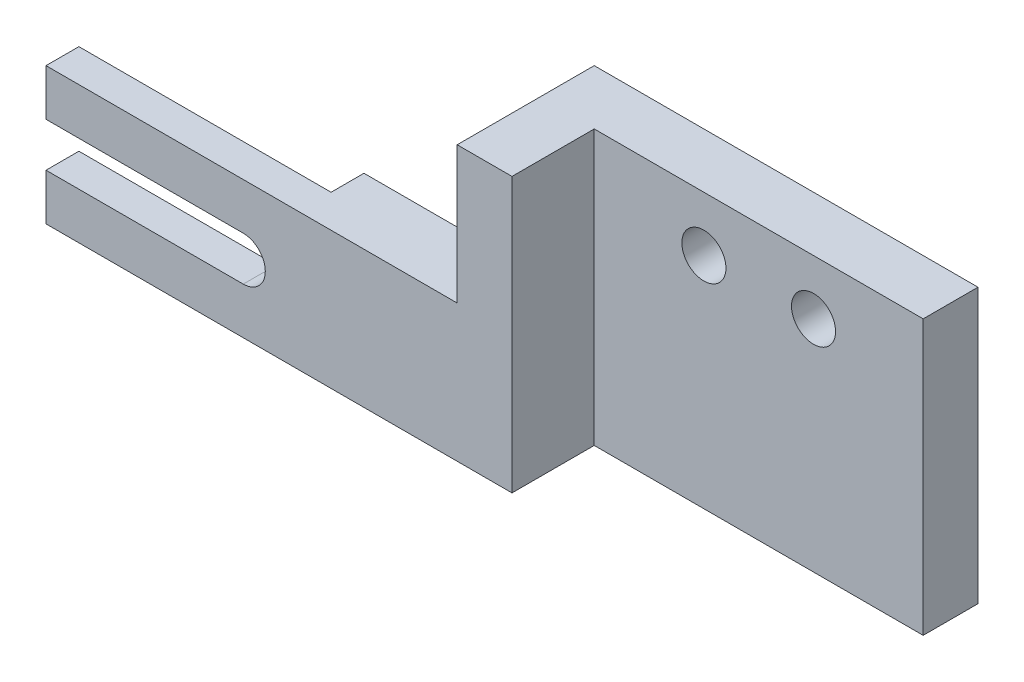
ISO-10303-21;
HEADER;
FILE_DESCRIPTION(('STEP AP214'),'2;1');
FILE_NAME('part.step','',(''),(''),'','','');
FILE_SCHEMA(('AUTOMOTIVE_DESIGN { 1 0 10303 214 1 1 1 1 }'));
ENDSEC;
DATA;
#1=APPLICATION_CONTEXT('core data for automotive mechanical design processes');
#2=APPLICATION_PROTOCOL_DEFINITION('international standard','automotive_design',2000,#1);
#3=PRODUCT_CONTEXT('',#1,'mechanical');
#4=PRODUCT('Part','Part','',(#3));
#5=PRODUCT_RELATED_PRODUCT_CATEGORY('part','',(#4));
#6=PRODUCT_DEFINITION_FORMATION('','',#4);
#7=PRODUCT_DEFINITION_CONTEXT('part definition',#1,'design');
#8=PRODUCT_DEFINITION('design','',#6,#7);
#9=PRODUCT_DEFINITION_SHAPE('','',#8);
#10=(LENGTH_UNIT() NAMED_UNIT(*) SI_UNIT(.MILLI.,.METRE.));
#11=(NAMED_UNIT(*) PLANE_ANGLE_UNIT() SI_UNIT($,.RADIAN.));
#12=(NAMED_UNIT(*) SI_UNIT($,.STERADIAN.) SOLID_ANGLE_UNIT());
#13=UNCERTAINTY_MEASURE_WITH_UNIT(LENGTH_MEASURE(1.E-05),#10,'distance_accuracy_value','');
#14=(GEOMETRIC_REPRESENTATION_CONTEXT(3) GLOBAL_UNCERTAINTY_ASSIGNED_CONTEXT((#13)) GLOBAL_UNIT_ASSIGNED_CONTEXT((#10,
#11,#12)) REPRESENTATION_CONTEXT('',''));
#15=CARTESIAN_POINT('',(0.,0.,0.));
#16=DIRECTION('',(0.,0.,1.));
#17=DIRECTION('',(1.,0.,0.));
#18=AXIS2_PLACEMENT_3D('',#15,#16,#17);
#19=CARTESIAN_POINT('',(1.58750000000002,15.875,-7.9375));
#20=DIRECTION('',(1.,0.,0.));
#21=DIRECTION('',(0.,1.,0.));
#22=AXIS2_PLACEMENT_3D('',#19,#20,#21);
#23=PLANE('',#22);
#24=DIRECTION('',(0.,-1.,0.));
#25=VECTOR('',#24,1.);
#26=CARTESIAN_POINT('',(1.58750000000002,0.,0.3175));
#27=LINE('',#26,#25);
#28=CARTESIAN_POINT('',(1.58750000000002,0.,0.3175));
#29=VERTEX_POINT('',#28);
#30=CARTESIAN_POINT('',(1.58750000000002,-15.875,0.3175));
#31=VERTEX_POINT('',#30);
#32=EDGE_CURVE('E225',#29,#31,#27,.T.);
#33=ORIENTED_EDGE('',*,*,#32,.F.);
#34=DIRECTION('',(0.,0.,1.));
#35=VECTOR('',#34,1.);
#36=CARTESIAN_POINT('',(1.58750000000002,0.,-7.9375));
#37=LINE('',#36,#35);
#38=CARTESIAN_POINT('',(1.58750000000002,0.,7.9375));
#39=VERTEX_POINT('',#38);
#40=EDGE_CURVE('E126',#29,#39,#37,.T.);
#41=ORIENTED_EDGE('',*,*,#40,.T.);
#42=DIRECTION('',(0.,1.,0.));
#43=VECTOR('',#42,1.);
#44=CARTESIAN_POINT('',(1.58750000000002,15.875,7.9375));
#45=LINE('',#44,#43);
#46=CARTESIAN_POINT('',(1.58750000000002,15.875,7.9375));
#47=VERTEX_POINT('',#46);
#48=EDGE_CURVE('E347',#39,#47,#45,.T.);
#49=ORIENTED_EDGE('',*,*,#48,.T.);
#50=DIRECTION('',(0.,0.,1.));
#51=VECTOR('',#50,1.);
#52=CARTESIAN_POINT('',(1.58750000000002,15.875,-7.9375));
#53=LINE('',#52,#51);
#54=CARTESIAN_POINT('',(1.58750000000002,15.875,-7.9375));
#55=VERTEX_POINT('',#54);
#56=EDGE_CURVE('E352',#55,#47,#53,.T.);
#57=ORIENTED_EDGE('',*,*,#56,.F.);
#58=DIRECTION('',(0.,1.,0.));
#59=VECTOR('',#58,1.);
#60=CARTESIAN_POINT('',(1.58750000000002,15.875,-7.9375));
#61=LINE('',#60,#59);
#62=CARTESIAN_POINT('',(1.58750000000002,-15.875,-7.9375));
#63=VERTEX_POINT('',#62);
#64=EDGE_CURVE('E342',#63,#55,#61,.T.);
#65=ORIENTED_EDGE('',*,*,#64,.F.);
#66=DIRECTION('',(0.,0.,-1.));
#67=VECTOR('',#66,1.);
#68=CARTESIAN_POINT('',(1.58750000000002,-15.875,-7.9375));
#69=LINE('',#68,#67);
#70=EDGE_CURVE('E133',#31,#63,#69,.T.);
#71=ORIENTED_EDGE('',*,*,#70,.F.);
#72=EDGE_LOOP('',(#33,#41,#49,#57,#65,#71));
#73=FACE_BOUND('',#72,.T.);
#74=ADVANCED_FACE('F110',(#73),#23,.F.);
#75=CARTESIAN_POINT('',(-46.0375,-15.876,4.1275));
#76=DIRECTION('',(0.,0.,1.));
#77=DIRECTION('',(1.,0.,0.));
#78=AXIS2_PLACEMENT_3D('',#75,#76,#77);
#79=PLANE('',#78);
#80=DIRECTION('',(0.,1.,0.));
#81=VECTOR('',#80,1.);
#82=CARTESIAN_POINT('',(-16.8275,0.,4.1275));
#83=LINE('',#82,#81);
#84=CARTESIAN_POINT('',(-16.8275,-15.875,4.1275));
#85=VERTEX_POINT('',#84);
#86=CARTESIAN_POINT('',(-16.8275,0.,4.1275));
#87=VERTEX_POINT('',#86);
#88=EDGE_CURVE('E251',#85,#87,#83,.T.);
#89=ORIENTED_EDGE('',*,*,#88,.F.);
#90=DIRECTION('',(1.,0.,0.));
#91=VECTOR('',#90,1.);
#92=CARTESIAN_POINT('',(-46.0375,-15.875,4.1275));
#93=LINE('',#92,#91);
#94=CARTESIAN_POINT('',(-46.0375,-15.875,4.1275));
#95=VERTEX_POINT('',#94);
#96=EDGE_CURVE('E234',#95,#85,#93,.T.);
#97=ORIENTED_EDGE('',*,*,#96,.F.);
#98=DIRECTION('',(0.,1.,0.));
#99=VECTOR('',#98,1.);
#100=CARTESIAN_POINT('',(-46.0375,-15.876,4.1275));
#101=LINE('',#100,#99);
#102=CARTESIAN_POINT('',(-46.0375,-10.4902,4.1275));
#103=VERTEX_POINT('',#102);
#104=EDGE_CURVE('E296',#95,#103,#101,.T.);
#105=ORIENTED_EDGE('',*,*,#104,.T.);
#106=DIRECTION('',(1.,0.,0.));
#107=VECTOR('',#106,1.);
#108=CARTESIAN_POINT('',(-46.0375,-10.4902,4.1275));
#109=LINE('',#108,#107);
#110=CARTESIAN_POINT('',(-23.1902,-10.4902,4.1275));
#111=VERTEX_POINT('',#110);
#112=EDGE_CURVE('E300',#103,#111,#109,.T.);
#113=ORIENTED_EDGE('',*,*,#112,.T.);
#114=CARTESIAN_POINT('',(-23.1902,-7.9375,4.1275));
#115=DIRECTION('',(0.,0.,1.));
#116=DIRECTION('',(1.,0.,0.));
#117=AXIS2_PLACEMENT_3D('',#114,#115,#116);
#118=CIRCLE('',#117,2.5527);
#119=CARTESIAN_POINT('',(-23.1902,-5.3848,4.1275));
#120=VERTEX_POINT('',#119);
#121=EDGE_CURVE('E297',#111,#120,#118,.T.);
#122=ORIENTED_EDGE('',*,*,#121,.T.);
#123=DIRECTION('',(-1.,0.,0.));
#124=VECTOR('',#123,1.);
#125=CARTESIAN_POINT('',(-46.0375,-5.3848,4.1275));
#126=LINE('',#125,#124);
#127=CARTESIAN_POINT('',(-46.0375,-5.3848,4.1275));
#128=VERTEX_POINT('',#127);
#129=EDGE_CURVE('E303',#120,#128,#126,.T.);
#130=ORIENTED_EDGE('',*,*,#129,.T.);
#131=CARTESIAN_POINT('',(-46.0375,0.,4.1275));
#132=VERTEX_POINT('',#131);
#133=EDGE_CURVE('E293',#128,#132,#101,.T.);
#134=ORIENTED_EDGE('',*,*,#133,.T.);
#135=DIRECTION('',(1.,0.,0.));
#136=VECTOR('',#135,1.);
#137=CARTESIAN_POINT('',(-46.0375,0.,4.1275));
#138=LINE('',#137,#136);
#139=EDGE_CURVE('E290',#132,#87,#138,.T.);
#140=ORIENTED_EDGE('',*,*,#139,.T.);
#141=EDGE_LOOP('',(#89,#97,#105,#113,#122,#130,#134,#140));
#142=FACE_BOUND('',#141,.T.);
#143=ADVANCED_FACE('F427',(#142),#79,.F.);
#144=CARTESIAN_POINT('',(-46.0375,15.875,7.9375));
#145=DIRECTION('',(1.,0.,0.));
#146=DIRECTION('',(0.,0.,-1.));
#147=AXIS2_PLACEMENT_3D('',#144,#145,#146);
#148=PLANE('',#147);
#149=DIRECTION('',(0.,0.,1.));
#150=VECTOR('',#149,1.);
#151=CARTESIAN_POINT('',(-46.0375,0.,-7.9375));
#152=LINE('',#151,#150);
#153=CARTESIAN_POINT('',(-46.0375,0.,7.9375));
#154=VERTEX_POINT('',#153);
#155=EDGE_CURVE('E346',#132,#154,#152,.T.);
#156=ORIENTED_EDGE('',*,*,#155,.F.);
#157=ORIENTED_EDGE('',*,*,#133,.F.);
#158=DIRECTION('',(0.,0.,1.));
#159=VECTOR('',#158,1.);
#160=CARTESIAN_POINT('',(-46.0375,-5.3848,7.9375));
#161=LINE('',#160,#159);
#162=CARTESIAN_POINT('',(-46.0375,-5.3848,7.9375));
#163=VERTEX_POINT('',#162);
#164=EDGE_CURVE('E330',#128,#163,#161,.T.);
#165=ORIENTED_EDGE('',*,*,#164,.T.);
#166=DIRECTION('',(0.,-1.,0.));
#167=VECTOR('',#166,1.);
#168=CARTESIAN_POINT('',(-46.0375,15.875,7.9375));
#169=LINE('',#168,#167);
#170=EDGE_CURVE('E119',#154,#163,#169,.T.);
#171=ORIENTED_EDGE('',*,*,#170,.F.);
#172=EDGE_LOOP('',(#156,#157,#165,#171));
#173=FACE_BOUND('',#172,.T.);
#174=ADVANCED_FACE('F424',(#173),#148,.F.);
#175=CARTESIAN_POINT('',(-46.0375,15.875,7.9375));
#176=DIRECTION('',(0.,0.,-1.));
#177=DIRECTION('',(-1.,0.,0.));
#178=AXIS2_PLACEMENT_3D('',#175,#176,#177);
#179=PLANE('',#178);
#180=DIRECTION('',(1.,0.,0.));
#181=VECTOR('',#180,1.);
#182=CARTESIAN_POINT('',(-46.0375,-15.875,7.9375));
#183=LINE('',#182,#181);
#184=CARTESIAN_POINT('',(-46.0375,-15.875,7.9375));
#185=VERTEX_POINT('',#184);
#186=CARTESIAN_POINT('',(7.93750000000002,-15.875,7.9375));
#187=VERTEX_POINT('',#186);
#188=EDGE_CURVE('E365',#185,#187,#183,.T.);
#189=ORIENTED_EDGE('',*,*,#188,.T.);
#190=DIRECTION('',(0.,1.,0.));
#191=VECTOR('',#190,1.);
#192=CARTESIAN_POINT('',(7.93750000000002,-15.876,7.9375));
#193=LINE('',#192,#191);
#194=CARTESIAN_POINT('',(7.93750000000002,15.875,7.9375));
#195=VERTEX_POINT('',#194);
#196=EDGE_CURVE('E267',#187,#195,#193,.T.);
#197=ORIENTED_EDGE('',*,*,#196,.T.);
#198=DIRECTION('',(1.,0.,0.));
#199=VECTOR('',#198,1.);
#200=CARTESIAN_POINT('',(-46.0375,15.875,7.9375));
#201=LINE('',#200,#199);
#202=EDGE_CURVE('E368',#47,#195,#201,.T.);
#203=ORIENTED_EDGE('',*,*,#202,.F.);
#204=ORIENTED_EDGE('',*,*,#48,.F.);
#205=DIRECTION('',(1.,0.,0.));
#206=VECTOR('',#205,1.);
#207=CARTESIAN_POINT('',(-46.0375,0.,7.9375));
#208=LINE('',#207,#206);
#209=EDGE_CURVE('E341',#154,#39,#208,.T.);
#210=ORIENTED_EDGE('',*,*,#209,.F.);
#211=ORIENTED_EDGE('',*,*,#170,.T.);
#212=DIRECTION('',(1.,0.,0.));
#213=VECTOR('',#212,1.);
#214=CARTESIAN_POINT('',(-56.1848,-5.3848,7.9375));
#215=LINE('',#214,#213);
#216=CARTESIAN_POINT('',(-23.1902,-5.3848,7.9375));
#217=VERTEX_POINT('',#216);
#218=EDGE_CURVE('E311',#163,#217,#215,.T.);
#219=ORIENTED_EDGE('',*,*,#218,.T.);
#220=CARTESIAN_POINT('',(-23.1902,-7.9375,7.9375));
#221=DIRECTION('',(0.,0.,1.));
#222=DIRECTION('',(1.,0.,0.));
#223=AXIS2_PLACEMENT_3D('',#220,#221,#222);
#224=CIRCLE('',#223,2.5527);
#225=CARTESIAN_POINT('',(-23.1902,-10.4902,7.9375));
#226=VERTEX_POINT('',#225);
#227=EDGE_CURVE('E315',#226,#217,#224,.T.);
#228=ORIENTED_EDGE('',*,*,#227,.F.);
#229=DIRECTION('',(1.,0.,0.));
#230=VECTOR('',#229,1.);
#231=CARTESIAN_POINT('',(-56.1848,-10.4902,7.9375));
#232=LINE('',#231,#230);
#233=CARTESIAN_POINT('',(-46.0375,-10.4902,7.9375));
#234=VERTEX_POINT('',#233);
#235=EDGE_CURVE('E308',#234,#226,#232,.T.);
#236=ORIENTED_EDGE('',*,*,#235,.F.);
#237=EDGE_CURVE('E372',#234,#185,#169,.T.);
#238=ORIENTED_EDGE('',*,*,#237,.T.);
#239=EDGE_LOOP('',(#189,#197,#203,#204,#210,#211,#219,#228,#236,#238));
#240=FACE_BOUND('',#239,.T.);
#241=ADVANCED_FACE('F394',(#240),#179,.F.);
#242=CARTESIAN_POINT('',(46.0375,15.875,7.9375));
#243=DIRECTION('',(-1.,0.,0.));
#244=DIRECTION('',(0.,0.,1.));
#245=AXIS2_PLACEMENT_3D('',#242,#243,#244);
#246=PLANE('',#245);
#247=DIRECTION('',(0.,0.,-1.));
#248=VECTOR('',#247,1.);
#249=CARTESIAN_POINT('',(46.0375,15.875,7.9375));
#250=LINE('',#249,#248);
#251=CARTESIAN_POINT('',(46.0375,15.875,-1.5875));
#252=VERTEX_POINT('',#251);
#253=CARTESIAN_POINT('',(46.0375,15.875,-7.9375));
#254=VERTEX_POINT('',#253);
#255=EDGE_CURVE('E361',#252,#254,#250,.T.);
#256=ORIENTED_EDGE('',*,*,#255,.F.);
#257=DIRECTION('',(0.,1.,0.));
#258=VECTOR('',#257,1.);
#259=CARTESIAN_POINT('',(46.0375,-15.876,-1.5875));
#260=LINE('',#259,#258);
#261=CARTESIAN_POINT('',(46.0375,-15.875,-1.5875));
#262=VERTEX_POINT('',#261);
#263=EDGE_CURVE('E266',#262,#252,#260,.T.);
#264=ORIENTED_EDGE('',*,*,#263,.F.);
#265=DIRECTION('',(0.,0.,-1.));
#266=VECTOR('',#265,1.);
#267=CARTESIAN_POINT('',(46.0375,-15.875,7.9375));
#268=LINE('',#267,#266);
#269=CARTESIAN_POINT('',(46.0375,-15.875,-7.9375));
#270=VERTEX_POINT('',#269);
#271=EDGE_CURVE('E356',#262,#270,#268,.T.);
#272=ORIENTED_EDGE('',*,*,#271,.T.);
#273=DIRECTION('',(0.,-1.,0.));
#274=VECTOR('',#273,1.);
#275=CARTESIAN_POINT('',(46.0375,15.875,-7.9375));
#276=LINE('',#275,#274);
#277=EDGE_CURVE('E13',#254,#270,#276,.T.);
#278=ORIENTED_EDGE('',*,*,#277,.F.);
#279=EDGE_LOOP('',(#256,#264,#272,#278));
#280=FACE_BOUND('',#279,.T.);
#281=ADVANCED_FACE('F112',(#280),#246,.F.);
#282=CARTESIAN_POINT('',(-46.0375,15.875,-7.9375));
#283=DIRECTION('',(0.,0.,1.));
#284=DIRECTION('',(1.,0.,0.));
#285=AXIS2_PLACEMENT_3D('',#282,#283,#284);
#286=PLANE('',#285);
#287=CARTESIAN_POINT('',(33.3375,9.525,-7.9375));
#288=DIRECTION('',(0.,0.,1.));
#289=DIRECTION('',(1.,0.,0.));
#290=AXIS2_PLACEMENT_3D('',#287,#288,#289);
#291=CIRCLE('',#290,2.5527);
#292=CARTESIAN_POINT('',(35.8902,9.525,-7.9375));
#293=VERTEX_POINT('',#292);
#294=EDGE_CURVE('E333',#293,#293,#291,.T.);
#295=ORIENTED_EDGE('',*,*,#294,.T.);
#296=EDGE_LOOP('',(#295));
#297=FACE_BOUND('',#296,.T.);
#298=CARTESIAN_POINT('',(20.6375,9.525,-7.9375));
#299=DIRECTION('',(0.,0.,1.));
#300=DIRECTION('',(1.,0.,0.));
#301=AXIS2_PLACEMENT_3D('',#298,#299,#300);
#302=CIRCLE('',#301,2.5527);
#303=CARTESIAN_POINT('',(23.1902,9.525,-7.9375));
#304=VERTEX_POINT('',#303);
#305=EDGE_CURVE('E337',#304,#304,#302,.T.);
#306=ORIENTED_EDGE('',*,*,#305,.T.);
#307=EDGE_LOOP('',(#306));
#308=FACE_BOUND('',#307,.T.);
#309=DIRECTION('',(-1.,0.,0.));
#310=VECTOR('',#309,1.);
#311=CARTESIAN_POINT('',(-46.0375,-15.875,-7.9375));
#312=LINE('',#311,#310);
#313=EDGE_CURVE('E375',#270,#63,#312,.T.);
#314=ORIENTED_EDGE('',*,*,#313,.T.);
#315=ORIENTED_EDGE('',*,*,#64,.T.);
#316=DIRECTION('',(-1.,0.,0.));
#317=VECTOR('',#316,1.);
#318=CARTESIAN_POINT('',(-46.0375,15.875,-7.9375));
#319=LINE('',#318,#317);
#320=EDGE_CURVE('E364',#254,#55,#319,.T.);
#321=ORIENTED_EDGE('',*,*,#320,.F.);
#322=ORIENTED_EDGE('',*,*,#277,.T.);
#323=EDGE_LOOP('',(#314,#315,#321,#322));
#324=FACE_BOUND('',#323,.T.);
#325=ADVANCED_FACE('F414',(#297,#308,#324),#286,.F.);
#326=DIRECTION('',(0.,0.,-1.));
#327=VECTOR('',#326,1.);
#328=CARTESIAN_POINT('',(-46.0375,-10.4902,7.9375));
#329=LINE('',#328,#327);
#330=EDGE_CURVE('E326',#234,#103,#329,.T.);
#331=ORIENTED_EDGE('',*,*,#330,.T.);
#332=ORIENTED_EDGE('',*,*,#104,.F.);
#333=DIRECTION('',(0.,0.,1.));
#334=VECTOR('',#333,1.);
#335=CARTESIAN_POINT('',(-46.0375,-15.875,7.9375));
#336=LINE('',#335,#334);
#337=EDGE_CURVE('E379',#95,#185,#336,.T.);
#338=ORIENTED_EDGE('',*,*,#337,.T.);
#339=ORIENTED_EDGE('',*,*,#237,.F.);
#340=EDGE_LOOP('',(#331,#332,#338,#339));
#341=FACE_BOUND('',#340,.T.);
#342=ADVANCED_FACE('F422',(#341),#148,.F.);
#343=CARTESIAN_POINT('',(0.,15.875,0.));
#344=DIRECTION('',(0.,-1.,0.));
#345=DIRECTION('',(0.,0.,-1.));
#346=AXIS2_PLACEMENT_3D('',#343,#344,#345);
#347=PLANE('',#346);
#348=DIRECTION('',(0.,0.,1.));
#349=VECTOR('',#348,1.);
#350=CARTESIAN_POINT('',(7.93750000000002,15.875,7.9375));
#351=LINE('',#350,#349);
#352=CARTESIAN_POINT('',(7.93750000000002,15.875,-1.5875));
#353=VERTEX_POINT('',#352);
#354=EDGE_CURVE('E263',#353,#195,#351,.T.);
#355=ORIENTED_EDGE('',*,*,#354,.F.);
#356=DIRECTION('',(-1.,0.,0.));
#357=VECTOR('',#356,1.);
#358=CARTESIAN_POINT('',(46.0375,15.875,-1.5875));
#359=LINE('',#358,#357);
#360=EDGE_CURVE('E259',#252,#353,#359,.T.);
#361=ORIENTED_EDGE('',*,*,#360,.F.);
#362=ORIENTED_EDGE('',*,*,#255,.T.);
#363=ORIENTED_EDGE('',*,*,#320,.T.);
#364=ORIENTED_EDGE('',*,*,#56,.T.);
#365=ORIENTED_EDGE('',*,*,#202,.T.);
#366=EDGE_LOOP('',(#355,#361,#362,#363,#364,#365));
#367=FACE_BOUND('',#366,.T.);
#368=ADVANCED_FACE('F408',(#367),#347,.F.);
#369=CARTESIAN_POINT('',(0.,-15.875,0.));
#370=DIRECTION('',(0.,-1.,0.));
#371=DIRECTION('',(0.,0.,-1.));
#372=AXIS2_PLACEMENT_3D('',#369,#370,#371);
#373=PLANE('',#372);
#374=DIRECTION('',(-1.,0.,0.));
#375=VECTOR('',#374,1.);
#376=CARTESIAN_POINT('',(1.58750000000002,-15.875,0.3175));
#377=LINE('',#376,#375);
#378=CARTESIAN_POINT('',(-16.8275,-15.875,0.3175));
#379=VERTEX_POINT('',#378);
#380=EDGE_CURVE('E218',#31,#379,#377,.T.);
#381=ORIENTED_EDGE('',*,*,#380,.F.);
#382=ORIENTED_EDGE('',*,*,#70,.T.);
#383=ORIENTED_EDGE('',*,*,#313,.F.);
#384=ORIENTED_EDGE('',*,*,#271,.F.);
#385=DIRECTION('',(-1.,0.,0.));
#386=VECTOR('',#385,1.);
#387=CARTESIAN_POINT('',(46.0375,-15.875,-1.5875));
#388=LINE('',#387,#386);
#389=CARTESIAN_POINT('',(7.93750000000002,-15.875,-1.5875));
#390=VERTEX_POINT('',#389);
#391=EDGE_CURVE('E284',#262,#390,#388,.T.);
#392=ORIENTED_EDGE('',*,*,#391,.T.);
#393=DIRECTION('',(0.,0.,1.));
#394=VECTOR('',#393,1.);
#395=CARTESIAN_POINT('',(7.93750000000002,-15.875,7.9375));
#396=LINE('',#395,#394);
#397=EDGE_CURVE('E238',#390,#187,#396,.T.);
#398=ORIENTED_EDGE('',*,*,#397,.T.);
#399=ORIENTED_EDGE('',*,*,#188,.F.);
#400=ORIENTED_EDGE('',*,*,#337,.F.);
#401=ORIENTED_EDGE('',*,*,#96,.T.);
#402=DIRECTION('',(0.,0.,1.));
#403=VECTOR('',#402,1.);
#404=CARTESIAN_POINT('',(-16.8275,-15.875,0.3175));
#405=LINE('',#404,#403);
#406=EDGE_CURVE('E231',#379,#85,#405,.T.);
#407=ORIENTED_EDGE('',*,*,#406,.F.);
#408=EDGE_LOOP('',(#381,#382,#383,#384,#392,#398,#399,#400,#401,#407));
#409=FACE_BOUND('',#408,.T.);
#410=ADVANCED_FACE('F232',(#409),#373,.T.);
#411=CARTESIAN_POINT('',(-46.0375,0.,-7.9375));
#412=DIRECTION('',(0.,-1.,0.));
#413=DIRECTION('',(0.,0.,-1.));
#414=AXIS2_PLACEMENT_3D('',#411,#412,#413);
#415=PLANE('',#414);
#416=ORIENTED_EDGE('',*,*,#40,.F.);
#417=DIRECTION('',(1.,0.,0.));
#418=VECTOR('',#417,1.);
#419=CARTESIAN_POINT('',(1.58750000000002,0.,0.3175));
#420=LINE('',#419,#418);
#421=CARTESIAN_POINT('',(-16.8275,0.,0.3175));
#422=VERTEX_POINT('',#421);
#423=EDGE_CURVE('E244',#422,#29,#420,.T.);
#424=ORIENTED_EDGE('',*,*,#423,.F.);
#425=DIRECTION('',(0.,0.,1.));
#426=VECTOR('',#425,1.);
#427=CARTESIAN_POINT('',(-16.8275,0.,0.3175));
#428=LINE('',#427,#426);
#429=EDGE_CURVE('E239',#422,#87,#428,.T.);
#430=ORIENTED_EDGE('',*,*,#429,.T.);
#431=ORIENTED_EDGE('',*,*,#139,.F.);
#432=ORIENTED_EDGE('',*,*,#155,.T.);
#433=ORIENTED_EDGE('',*,*,#209,.T.);
#434=EDGE_LOOP('',(#416,#424,#430,#431,#432,#433));
#435=FACE_BOUND('',#434,.T.);
#436=ADVANCED_FACE('F438',(#435),#415,.F.);
#437=CARTESIAN_POINT('',(20.6375,9.525,7.9375));
#438=DIRECTION('',(0.,0.,1.));
#439=DIRECTION('',(1.,0.,0.));
#440=AXIS2_PLACEMENT_3D('',#437,#438,#439);
#441=CYLINDRICAL_SURFACE('',#440,2.5527);
#442=CARTESIAN_POINT('',(20.6375,9.525,-1.5875));
#443=DIRECTION('',(0.,0.,-1.));
#444=DIRECTION('',(-1.,0.,0.));
#445=AXIS2_PLACEMENT_3D('',#442,#443,#444);
#446=CIRCLE('',#445,2.5527);
#447=CARTESIAN_POINT('',(18.0848,9.525,-1.5875));
#448=VERTEX_POINT('',#447);
#449=EDGE_CURVE('E280',#448,#448,#446,.T.);
#450=ORIENTED_EDGE('',*,*,#449,.F.);
#451=EDGE_LOOP('',(#450));
#452=FACE_BOUND('',#451,.T.);
#453=ORIENTED_EDGE('',*,*,#305,.F.);
#454=EDGE_LOOP('',(#453));
#455=FACE_BOUND('',#454,.T.);
#456=ADVANCED_FACE('F436',(#452,#455),#441,.F.);
#457=CARTESIAN_POINT('',(33.3375,9.525,7.9375));
#458=DIRECTION('',(0.,0.,1.));
#459=DIRECTION('',(1.,0.,0.));
#460=AXIS2_PLACEMENT_3D('',#457,#458,#459);
#461=CYLINDRICAL_SURFACE('',#460,2.5527);
#462=CARTESIAN_POINT('',(33.3375,9.525,-1.5875));
#463=DIRECTION('',(0.,0.,-1.));
#464=DIRECTION('',(-1.,0.,0.));
#465=AXIS2_PLACEMENT_3D('',#462,#463,#464);
#466=CIRCLE('',#465,2.5527);
#467=CARTESIAN_POINT('',(30.7848,9.525,-1.5875));
#468=VERTEX_POINT('',#467);
#469=EDGE_CURVE('E271',#468,#468,#466,.T.);
#470=ORIENTED_EDGE('',*,*,#469,.F.);
#471=EDGE_LOOP('',(#470));
#472=FACE_BOUND('',#471,.T.);
#473=ORIENTED_EDGE('',*,*,#294,.F.);
#474=EDGE_LOOP('',(#473));
#475=FACE_BOUND('',#474,.T.);
#476=ADVANCED_FACE('F477',(#472,#475),#461,.F.);
#477=CARTESIAN_POINT('',(-56.1848,-5.3848,7.9375));
#478=DIRECTION('',(0.,1.,0.));
#479=DIRECTION('',(0.,0.,1.));
#480=AXIS2_PLACEMENT_3D('',#477,#478,#479);
#481=PLANE('',#480);
#482=ORIENTED_EDGE('',*,*,#164,.F.);
#483=ORIENTED_EDGE('',*,*,#129,.F.);
#484=DIRECTION('',(0.,0.,1.));
#485=VECTOR('',#484,1.);
#486=CARTESIAN_POINT('',(-23.1902,-5.3848,7.9375));
#487=LINE('',#486,#485);
#488=EDGE_CURVE('E319',#120,#217,#487,.T.);
#489=ORIENTED_EDGE('',*,*,#488,.T.);
#490=ORIENTED_EDGE('',*,*,#218,.F.);
#491=EDGE_LOOP('',(#482,#483,#489,#490));
#492=FACE_BOUND('',#491,.T.);
#493=ADVANCED_FACE('F460',(#492),#481,.F.);
#494=CARTESIAN_POINT('',(-56.1848,-10.4902,7.9375));
#495=DIRECTION('',(0.,-1.,0.));
#496=DIRECTION('',(0.,0.,-1.));
#497=AXIS2_PLACEMENT_3D('',#494,#495,#496);
#498=PLANE('',#497);
#499=DIRECTION('',(0.,0.,1.));
#500=VECTOR('',#499,1.);
#501=CARTESIAN_POINT('',(-23.1902,-10.4902,7.9375));
#502=LINE('',#501,#500);
#503=EDGE_CURVE('E322',#226,#111,#502,.F.);
#504=ORIENTED_EDGE('',*,*,#503,.T.);
#505=ORIENTED_EDGE('',*,*,#112,.F.);
#506=ORIENTED_EDGE('',*,*,#330,.F.);
#507=ORIENTED_EDGE('',*,*,#235,.T.);
#508=EDGE_LOOP('',(#504,#505,#506,#507));
#509=FACE_BOUND('',#508,.T.);
#510=ADVANCED_FACE('F467',(#509),#498,.F.);
#511=CARTESIAN_POINT('',(-23.1902,-7.9375,7.9375));
#512=DIRECTION('',(0.,0.,1.));
#513=DIRECTION('',(1.,0.,0.));
#514=AXIS2_PLACEMENT_3D('',#511,#512,#513);
#515=CYLINDRICAL_SURFACE('',#514,2.5527);
#516=ORIENTED_EDGE('',*,*,#488,.F.);
#517=ORIENTED_EDGE('',*,*,#121,.F.);
#518=ORIENTED_EDGE('',*,*,#503,.F.);
#519=ORIENTED_EDGE('',*,*,#227,.T.);
#520=EDGE_LOOP('',(#516,#517,#518,#519));
#521=FACE_BOUND('',#520,.T.);
#522=ADVANCED_FACE('F463',(#521),#515,.F.);
#523=CARTESIAN_POINT('',(46.0375,-15.876,-1.5875));
#524=DIRECTION('',(0.,0.,-1.));
#525=DIRECTION('',(-1.,0.,0.));
#526=AXIS2_PLACEMENT_3D('',#523,#524,#525);
#527=PLANE('',#526);
#528=ORIENTED_EDGE('',*,*,#449,.T.);
#529=EDGE_LOOP('',(#528));
#530=FACE_BOUND('',#529,.T.);
#531=ORIENTED_EDGE('',*,*,#469,.T.);
#532=EDGE_LOOP('',(#531));
#533=FACE_BOUND('',#532,.T.);
#534=ORIENTED_EDGE('',*,*,#263,.T.);
#535=ORIENTED_EDGE('',*,*,#360,.T.);
#536=DIRECTION('',(0.,1.,0.));
#537=VECTOR('',#536,1.);
#538=CARTESIAN_POINT('',(7.93750000000002,-15.876,-1.5875));
#539=LINE('',#538,#537);
#540=EDGE_CURVE('E272',#390,#353,#539,.T.);
#541=ORIENTED_EDGE('',*,*,#540,.F.);
#542=ORIENTED_EDGE('',*,*,#391,.F.);
#543=EDGE_LOOP('',(#534,#535,#541,#542));
#544=FACE_BOUND('',#543,.T.);
#545=ADVANCED_FACE('F402',(#530,#533,#544),#527,.F.);
#546=CARTESIAN_POINT('',(7.93750000000002,-15.876,7.9375));
#547=DIRECTION('',(-1.,0.,0.));
#548=DIRECTION('',(0.,0.,1.));
#549=AXIS2_PLACEMENT_3D('',#546,#547,#548);
#550=PLANE('',#549);
#551=ORIENTED_EDGE('',*,*,#540,.T.);
#552=ORIENTED_EDGE('',*,*,#354,.T.);
#553=ORIENTED_EDGE('',*,*,#196,.F.);
#554=ORIENTED_EDGE('',*,*,#397,.F.);
#555=EDGE_LOOP('',(#551,#552,#553,#554));
#556=FACE_BOUND('',#555,.T.);
#557=ADVANCED_FACE('F400',(#556),#550,.F.);
#558=CARTESIAN_POINT('',(-16.8275,0.,0.3175));
#559=DIRECTION('',(1.,0.,0.));
#560=DIRECTION('',(0.,1.,0.));
#561=AXIS2_PLACEMENT_3D('',#558,#559,#560);
#562=PLANE('',#561);
#563=ORIENTED_EDGE('',*,*,#88,.T.);
#564=ORIENTED_EDGE('',*,*,#429,.F.);
#565=DIRECTION('',(0.,1.,0.));
#566=VECTOR('',#565,1.);
#567=CARTESIAN_POINT('',(-16.8275,0.,0.3175));
#568=LINE('',#567,#566);
#569=EDGE_CURVE('E223',#379,#422,#568,.T.);
#570=ORIENTED_EDGE('',*,*,#569,.F.);
#571=ORIENTED_EDGE('',*,*,#406,.T.);
#572=EDGE_LOOP('',(#563,#564,#570,#571));
#573=FACE_BOUND('',#572,.T.);
#574=ADVANCED_FACE('F241',(#573),#562,.F.);
#575=CARTESIAN_POINT('',(0.,0.,0.3175));
#576=DIRECTION('',(0.,0.,-1.));
#577=DIRECTION('',(-1.,0.,0.));
#578=AXIS2_PLACEMENT_3D('',#575,#576,#577);
#579=PLANE('',#578);
#580=ORIENTED_EDGE('',*,*,#32,.T.);
#581=ORIENTED_EDGE('',*,*,#380,.T.);
#582=ORIENTED_EDGE('',*,*,#569,.T.);
#583=ORIENTED_EDGE('',*,*,#423,.T.);
#584=EDGE_LOOP('',(#580,#581,#582,#583));
#585=FACE_BOUND('',#584,.T.);
#586=ADVANCED_FACE('F220',(#585),#579,.T.);
#587=CLOSED_SHELL('',(#74,#143,#174,#241,#281,#325,#342,#368,#410,#436,#456,#476,#493,#510,#522,
#545,#557,#574,#586));
#588=MANIFOLD_SOLID_BREP('B2',#587);
#589=ADVANCED_BREP_SHAPE_REPRESENTATION('',(#18,#588),#14);
#590=SHAPE_DEFINITION_REPRESENTATION(#9,#589);
ENDSEC;
END-ISO-10303-21;
